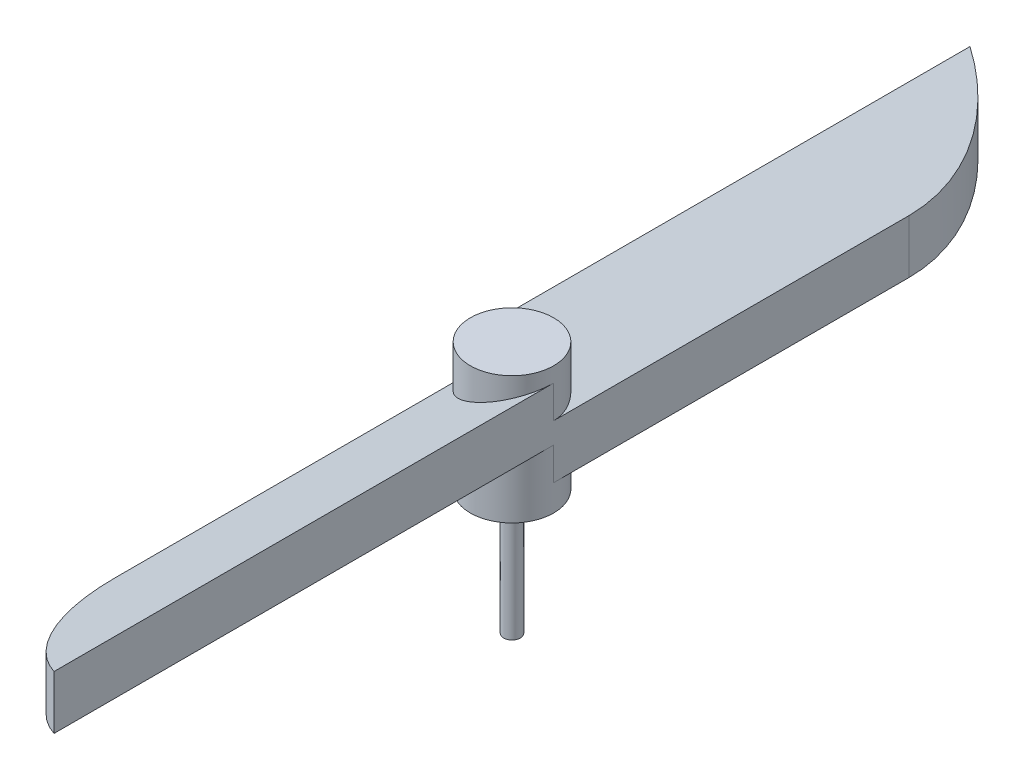
ISO-10303-21;
HEADER;
FILE_DESCRIPTION(('STEP AP214'),'2;1');
FILE_NAME('part.step','',(''),(''),'','','');
FILE_SCHEMA(('AUTOMOTIVE_DESIGN { 1 0 10303 214 1 1 1 1 }'));
ENDSEC;
DATA;
#1=APPLICATION_CONTEXT('core data for automotive mechanical design processes');
#2=APPLICATION_PROTOCOL_DEFINITION('international standard','automotive_design',2000,#1);
#3=PRODUCT_CONTEXT('',#1,'mechanical');
#4=PRODUCT('Part','Part','',(#3));
#5=PRODUCT_RELATED_PRODUCT_CATEGORY('part','',(#4));
#6=PRODUCT_DEFINITION_FORMATION('','',#4);
#7=PRODUCT_DEFINITION_CONTEXT('part definition',#1,'design');
#8=PRODUCT_DEFINITION('design','',#6,#7);
#9=PRODUCT_DEFINITION_SHAPE('','',#8);
#10=(LENGTH_UNIT() NAMED_UNIT(*) SI_UNIT(.MILLI.,.METRE.));
#11=(NAMED_UNIT(*) PLANE_ANGLE_UNIT() SI_UNIT($,.RADIAN.));
#12=(NAMED_UNIT(*) SI_UNIT($,.STERADIAN.) SOLID_ANGLE_UNIT());
#13=UNCERTAINTY_MEASURE_WITH_UNIT(LENGTH_MEASURE(1.E-05),#10,'distance_accuracy_value','');
#14=(GEOMETRIC_REPRESENTATION_CONTEXT(3) GLOBAL_UNCERTAINTY_ASSIGNED_CONTEXT((#13)) GLOBAL_UNIT_ASSIGNED_CONTEXT((#10,
#11,#12)) REPRESENTATION_CONTEXT('',''));
#15=CARTESIAN_POINT('',(0.,0.,0.));
#16=DIRECTION('',(0.,0.,1.));
#17=DIRECTION('',(1.,0.,0.));
#18=AXIS2_PLACEMENT_3D('',#15,#16,#17);
#19=CARTESIAN_POINT('',(-46.0014411221915,60.3501293978421,200.));
#20=DIRECTION('',(0.365067986182281,-0.930980862029298,0.));
#21=DIRECTION('',(0.9309808620293,0.36506798618228,0.));
#22=AXIS2_PLACEMENT_3D('',#19,#20,#21);
#23=PLANE('',#22);
#24=DIRECTION('',(0.,0.,1.));
#25=VECTOR('',#24,1.);
#26=CARTESIAN_POINT('',(2.50000000000003,79.3691277033729,200.000000000001));
#27=LINE('',#26,#25);
#28=CARTESIAN_POINT('',(2.5,79.3691277033728,0.));
#29=VERTEX_POINT('',#28);
#30=CARTESIAN_POINT('',(2.5,79.3691277033728,30.));
#31=VERTEX_POINT('',#30);
#32=EDGE_CURVE('E218',#29,#31,#27,.T.);
#33=ORIENTED_EDGE('',*,*,#32,.T.);
#34=CARTESIAN_POINT('',(7.50000000000001,81.3297909192984,21.3397459621556));
#35=DIRECTION('',(0.365067986182281,-0.930980862029298,0.));
#36=DIRECTION('',(0.9309808620293,0.36506798618228,0.));
#37=AXIS2_PLACEMENT_3D('',#34,#35,#36);
#38=ELLIPSE('',#37,10.7413593639321,10.);
#39=CARTESIAN_POINT('',(-2.5,77.4084644874475,21.3397459621557));
#40=VERTEX_POINT('',#39);
#41=EDGE_CURVE('E57',#31,#40,#38,.T.);
#42=ORIENTED_EDGE('',*,*,#41,.T.);
#43=DIRECTION('',(0.,0.,-1.));
#44=VECTOR('',#43,1.);
#45=CARTESIAN_POINT('',(-2.49999999999992,77.4084644874475,200.000000000001));
#46=LINE('',#45,#44);
#47=CARTESIAN_POINT('',(-2.5,77.4084644874474,0.));
#48=VERTEX_POINT('',#47);
#49=EDGE_CURVE('E112',#40,#48,#46,.T.);
#50=ORIENTED_EDGE('',*,*,#49,.T.);
#51=CARTESIAN_POINT('',(0.,78.3887960954102,0.));
#52=DIRECTION('',(0.365067986182281,-0.930980862029298,0.));
#53=DIRECTION('',(-0.9309808620293,-0.36506798618228,0.));
#54=AXIS2_PLACEMENT_3D('',#51,#52,#53);
#55=ELLIPSE('',#54,2.68533984098303,2.5);
#56=EDGE_CURVE('E141',#29,#48,#55,.T.);
#57=ORIENTED_EDGE('',*,*,#56,.F.);
#58=EDGE_LOOP('',(#33,#42,#50,#57));
#59=FACE_BOUND('',#58,.T.);
#60=ADVANCED_FACE('F33',(#59),#23,.T.);
#61=CARTESIAN_POINT('',(-47.0966450807384,63.14307198393,200.));
#62=DIRECTION('',(-0.365067986182281,0.930980862029298,0.));
#63=DIRECTION('',(-0.9309808620293,-0.36506798618228,0.));
#64=AXIS2_PLACEMENT_3D('',#61,#62,#63);
#65=PLANE('',#64);
#66=DIRECTION('',(0.,0.,1.));
#67=VECTOR('',#66,1.);
#68=CARTESIAN_POINT('',(-2.49999999999997,80.6308722966271,200.000000000001));
#69=LINE('',#68,#67);
#70=CARTESIAN_POINT('',(-2.5,80.6308722966271,0.));
#71=VERTEX_POINT('',#70);
#72=CARTESIAN_POINT('',(-2.49999999999997,80.630872296627,21.3397459621557));
#73=VERTEX_POINT('',#72);
#74=EDGE_CURVE('E146',#71,#73,#69,.T.);
#75=ORIENTED_EDGE('',*,*,#74,.T.);
#76=CARTESIAN_POINT('',(7.50000000000001,84.552198728478,21.3397459621556));
#77=DIRECTION('',(-0.365067986182281,0.930980862029298,0.));
#78=DIRECTION('',(0.9309808620293,0.36506798618228,0.));
#79=AXIS2_PLACEMENT_3D('',#76,#77,#78);
#80=ELLIPSE('',#79,10.7413593639321,10.);
#81=CARTESIAN_POINT('',(2.5,82.5915355125524,30.));
#82=VERTEX_POINT('',#81);
#83=EDGE_CURVE('E155',#73,#82,#80,.T.);
#84=ORIENTED_EDGE('',*,*,#83,.T.);
#85=DIRECTION('',(0.,0.,-1.));
#86=VECTOR('',#85,1.);
#87=CARTESIAN_POINT('',(2.50000000000003,82.5915355125525,200.000000000001));
#88=LINE('',#87,#86);
#89=CARTESIAN_POINT('',(2.5,82.5915355125525,0.));
#90=VERTEX_POINT('',#89);
#91=EDGE_CURVE('E144',#82,#90,#88,.T.);
#92=ORIENTED_EDGE('',*,*,#91,.T.);
#93=CARTESIAN_POINT('',(0.,81.6112039045898,0.));
#94=DIRECTION('',(-0.365067986182281,0.930980862029298,0.));
#95=DIRECTION('',(-0.9309808620293,-0.36506798618228,0.));
#96=AXIS2_PLACEMENT_3D('',#93,#94,#95);
#97=ELLIPSE('',#96,2.68533984098303,2.5);
#98=EDGE_CURVE('E107',#71,#90,#97,.T.);
#99=ORIENTED_EDGE('',*,*,#98,.F.);
#100=EDGE_LOOP('',(#75,#84,#92,#99));
#101=FACE_BOUND('',#100,.T.);
#102=ADVANCED_FACE('F182',(#101),#65,.T.);
#103=CARTESIAN_POINT('',(-1.11022302462516E-13,100.,0.));
#104=DIRECTION('',(0.,-1.,0.));
#105=DIRECTION('',(0.,0.,-1.));
#106=AXIS2_PLACEMENT_3D('',#103,#104,#105);
#107=CYLINDRICAL_SURFACE('',#106,2.5);
#108=CARTESIAN_POINT('',(0.,75.8299404564052,0.));
#109=DIRECTION('',(0.,1.,0.));
#110=DIRECTION('',(0.,0.,1.));
#111=AXIS2_PLACEMENT_3D('',#108,#109,#110);
#112=CIRCLE('',#111,2.5);
#113=CARTESIAN_POINT('',(0.,75.8299404564052,2.49999999999995));
#114=VERTEX_POINT('',#113);
#115=EDGE_CURVE('E37',#114,#114,#112,.T.);
#116=ORIENTED_EDGE('',*,*,#115,.T.);
#117=EDGE_LOOP('',(#116));
#118=FACE_BOUND('',#117,.T.);
#119=ORIENTED_EDGE('',*,*,#56,.T.);
#120=DIRECTION('',(0.,-1.,0.));
#121=VECTOR('',#120,1.);
#122=CARTESIAN_POINT('',(-2.50000000000006,100.,0.));
#123=LINE('',#122,#121);
#124=CARTESIAN_POINT('',(-2.5,79.3691277033728,0.));
#125=VERTEX_POINT('',#124);
#126=EDGE_CURVE('E111',#125,#48,#123,.T.);
#127=ORIENTED_EDGE('',*,*,#126,.F.);
#128=CARTESIAN_POINT('',(0.,78.3887960954102,0.));
#129=DIRECTION('',(-0.365067986182281,-0.930980862029298,0.));
#130=DIRECTION('',(0.9309808620293,-0.36506798618228,0.));
#131=AXIS2_PLACEMENT_3D('',#128,#129,#130);
#132=ELLIPSE('',#131,2.68533984098303,2.5);
#133=CARTESIAN_POINT('',(2.5,77.4084644874474,0.));
#134=VERTEX_POINT('',#133);
#135=EDGE_CURVE('E128',#125,#134,#132,.T.);
#136=ORIENTED_EDGE('',*,*,#135,.T.);
#137=DIRECTION('',(0.,-1.,0.));
#138=VECTOR('',#137,1.);
#139=CARTESIAN_POINT('',(2.49999999999986,100.,0.));
#140=LINE('',#139,#138);
#141=EDGE_CURVE('E123',#29,#134,#140,.T.);
#142=ORIENTED_EDGE('',*,*,#141,.F.);
#143=EDGE_LOOP('',(#119,#127,#136,#142));
#144=FACE_BOUND('',#143,.T.);
#145=ADVANCED_FACE('F162',(#118,#144),#107,.T.);
#146=CARTESIAN_POINT('',(46.0014411221915,60.3501293978421,-200.000000000001));
#147=DIRECTION('',(-0.365067986182281,-0.930980862029298,0.));
#148=DIRECTION('',(0.9309808620293,-0.36506798618228,0.));
#149=AXIS2_PLACEMENT_3D('',#146,#147,#148);
#150=PLANE('',#149);
#151=DIRECTION('',(0.,0.,-1.));
#152=VECTOR('',#151,1.);
#153=CARTESIAN_POINT('',(-2.49999999999997,79.3691277033729,-200.000000000001));
#154=LINE('',#153,#152);
#155=CARTESIAN_POINT('',(-2.49999999999997,79.369127703373,-30.0000000000001));
#156=VERTEX_POINT('',#155);
#157=EDGE_CURVE('E133',#125,#156,#154,.T.);
#158=ORIENTED_EDGE('',*,*,#157,.T.);
#159=CARTESIAN_POINT('',(-7.50000000000001,81.3297909192983,-21.3397459621557));
#160=DIRECTION('',(-0.365067986182281,-0.930980862029298,0.));
#161=DIRECTION('',(-0.9309808620293,0.36506798618228,0.));
#162=AXIS2_PLACEMENT_3D('',#159,#160,#161);
#163=ELLIPSE('',#162,10.7413593639321,10.);
#164=CARTESIAN_POINT('',(2.50000000000003,77.4084644874475,-21.3397459621557));
#165=VERTEX_POINT('',#164);
#166=EDGE_CURVE('E148',#156,#165,#163,.T.);
#167=ORIENTED_EDGE('',*,*,#166,.T.);
#168=DIRECTION('',(0.,0.,1.));
#169=VECTOR('',#168,1.);
#170=CARTESIAN_POINT('',(2.50000000000003,77.4084644874475,-200.000000000001));
#171=LINE('',#170,#169);
#172=EDGE_CURVE('E229',#165,#134,#171,.T.);
#173=ORIENTED_EDGE('',*,*,#172,.T.);
#174=ORIENTED_EDGE('',*,*,#135,.F.);
#175=EDGE_LOOP('',(#158,#167,#173,#174));
#176=FACE_BOUND('',#175,.T.);
#177=ADVANCED_FACE('F196',(#176),#150,.T.);
#178=CARTESIAN_POINT('',(47.0966450807384,63.1430719839299,-200.000000000001));
#179=DIRECTION('',(0.365067986182281,0.930980862029298,0.));
#180=DIRECTION('',(-0.9309808620293,0.36506798618228,0.));
#181=AXIS2_PLACEMENT_3D('',#178,#179,#180);
#182=PLANE('',#181);
#183=DIRECTION('',(0.,0.,-1.));
#184=VECTOR('',#183,1.);
#185=CARTESIAN_POINT('',(2.50000000000003,80.6308722966271,-200.000000000001));
#186=LINE('',#185,#184);
#187=CARTESIAN_POINT('',(2.5,80.6308722966271,0.));
#188=VERTEX_POINT('',#187);
#189=CARTESIAN_POINT('',(2.5,80.630872296627,-21.3397459621557));
#190=VERTEX_POINT('',#189);
#191=EDGE_CURVE('E115',#188,#190,#186,.T.);
#192=ORIENTED_EDGE('',*,*,#191,.T.);
#193=CARTESIAN_POINT('',(-7.50000000000001,84.5521987284779,-21.3397459621557));
#194=DIRECTION('',(0.365067986182281,0.930980862029298,0.));
#195=DIRECTION('',(-0.9309808620293,0.36506798618228,0.));
#196=AXIS2_PLACEMENT_3D('',#193,#194,#195);
#197=ELLIPSE('',#196,10.7413593639321,10.);
#198=CARTESIAN_POINT('',(-2.5,82.5915355125526,-30.0000000000001));
#199=VERTEX_POINT('',#198);
#200=EDGE_CURVE('E151',#190,#199,#197,.T.);
#201=ORIENTED_EDGE('',*,*,#200,.T.);
#202=DIRECTION('',(0.,0.,1.));
#203=VECTOR('',#202,1.);
#204=CARTESIAN_POINT('',(-2.5,82.5915355125525,-200.000000000001));
#205=LINE('',#204,#203);
#206=CARTESIAN_POINT('',(-2.5,82.5915355125525,0.));
#207=VERTEX_POINT('',#206);
#208=EDGE_CURVE('E122',#199,#207,#205,.T.);
#209=ORIENTED_EDGE('',*,*,#208,.T.);
#210=CARTESIAN_POINT('',(0.,81.6112039045898,0.));
#211=DIRECTION('',(0.365067986182281,0.930980862029298,0.));
#212=DIRECTION('',(0.9309808620293,-0.36506798618228,0.));
#213=AXIS2_PLACEMENT_3D('',#210,#211,#212);
#214=ELLIPSE('',#213,2.68533984098303,2.5);
#215=EDGE_CURVE('E105',#188,#207,#214,.T.);
#216=ORIENTED_EDGE('',*,*,#215,.F.);
#217=EDGE_LOOP('',(#192,#201,#209,#216));
#218=FACE_BOUND('',#217,.T.);
#219=ADVANCED_FACE('F126',(#218),#182,.T.);
#220=ORIENTED_EDGE('',*,*,#215,.T.);
#221=DIRECTION('',(0.,-1.,0.));
#222=VECTOR('',#221,1.);
#223=CARTESIAN_POINT('',(-2.50000000000006,100.,0.));
#224=LINE('',#223,#222);
#225=EDGE_CURVE('E129',#71,#207,#224,.F.);
#226=ORIENTED_EDGE('',*,*,#225,.F.);
#227=ORIENTED_EDGE('',*,*,#98,.T.);
#228=DIRECTION('',(0.,-1.,0.));
#229=VECTOR('',#228,1.);
#230=CARTESIAN_POINT('',(2.49999999999986,100.,0.));
#231=LINE('',#230,#229);
#232=EDGE_CURVE('E99',#188,#90,#231,.F.);
#233=ORIENTED_EDGE('',*,*,#232,.F.);
#234=EDGE_LOOP('',(#220,#226,#227,#233));
#235=FACE_BOUND('',#234,.T.);
#236=CARTESIAN_POINT('',(0.,83.4888782326502,0.));
#237=DIRECTION('',(0.,-1.,0.));
#238=DIRECTION('',(0.,0.,-1.));
#239=AXIS2_PLACEMENT_3D('',#236,#237,#238);
#240=CIRCLE('',#239,2.5);
#241=CARTESIAN_POINT('',(0.,83.4888782326502,-2.50000000000003));
#242=VERTEX_POINT('',#241);
#243=EDGE_CURVE('E156',#242,#242,#240,.T.);
#244=ORIENTED_EDGE('',*,*,#243,.T.);
#245=EDGE_LOOP('',(#244));
#246=FACE_BOUND('',#245,.T.);
#247=ADVANCED_FACE('F101',(#235,#246),#107,.T.);
#248=CARTESIAN_POINT('',(-2.5,305.876368794046,0.));
#249=DIRECTION('',(-1.,0.,0.));
#250=DIRECTION('',(0.,0.,1.));
#251=AXIS2_PLACEMENT_3D('',#248,#249,#250);
#252=PLANE('',#251);
#253=ORIENTED_EDGE('',*,*,#49,.F.);
#254=DIRECTION('',(0.,-1.,0.));
#255=VECTOR('',#254,1.);
#256=CARTESIAN_POINT('',(-2.49999999999997,80.6308722966271,21.3397459621557));
#257=LINE('',#256,#255);
#258=EDGE_CURVE('E49',#40,#73,#257,.F.);
#259=ORIENTED_EDGE('',*,*,#258,.T.);
#260=ORIENTED_EDGE('',*,*,#74,.F.);
#261=ORIENTED_EDGE('',*,*,#225,.T.);
#262=ORIENTED_EDGE('',*,*,#208,.F.);
#263=DIRECTION('',(0.,-1.,0.));
#264=VECTOR('',#263,1.);
#265=CARTESIAN_POINT('',(-2.5,305.876368794046,-30.0000000000001));
#266=LINE('',#265,#264);
#267=EDGE_CURVE('E211',#199,#156,#266,.T.);
#268=ORIENTED_EDGE('',*,*,#267,.T.);
#269=ORIENTED_EDGE('',*,*,#157,.F.);
#270=ORIENTED_EDGE('',*,*,#126,.T.);
#271=EDGE_LOOP('',(#253,#259,#260,#261,#262,#268,#269,#270));
#272=FACE_BOUND('',#271,.T.);
#273=ADVANCED_FACE('F193',(#272),#252,.T.);
#274=CARTESIAN_POINT('',(2.5,305.876368794046,0.));
#275=DIRECTION('',(1.,0.,0.));
#276=DIRECTION('',(0.,0.,-1.));
#277=AXIS2_PLACEMENT_3D('',#274,#275,#276);
#278=PLANE('',#277);
#279=ORIENTED_EDGE('',*,*,#172,.F.);
#280=DIRECTION('',(0.,-1.,0.));
#281=VECTOR('',#280,1.);
#282=CARTESIAN_POINT('',(2.5,80.6308722966271,-21.3397459621557));
#283=LINE('',#282,#281);
#284=EDGE_CURVE('E119',#165,#190,#283,.F.);
#285=ORIENTED_EDGE('',*,*,#284,.T.);
#286=ORIENTED_EDGE('',*,*,#191,.F.);
#287=ORIENTED_EDGE('',*,*,#232,.T.);
#288=ORIENTED_EDGE('',*,*,#91,.F.);
#289=DIRECTION('',(0.,-1.,0.));
#290=VECTOR('',#289,1.);
#291=CARTESIAN_POINT('',(2.5,334.879586361473,30.));
#292=LINE('',#291,#290);
#293=EDGE_CURVE('E217',#82,#31,#292,.T.);
#294=ORIENTED_EDGE('',*,*,#293,.T.);
#295=ORIENTED_EDGE('',*,*,#32,.F.);
#296=ORIENTED_EDGE('',*,*,#141,.T.);
#297=EDGE_LOOP('',(#279,#285,#286,#287,#288,#294,#295,#296));
#298=FACE_BOUND('',#297,.T.);
#299=ADVANCED_FACE('F117',(#298),#278,.T.);
#300=CARTESIAN_POINT('',(-7.50000000000006,305.876368794046,-21.3397459621557));
#301=DIRECTION('',(0.,1.,0.));
#302=DIRECTION('',(0.,0.,1.));
#303=AXIS2_PLACEMENT_3D('',#300,#301,#302);
#304=CYLINDRICAL_SURFACE('',#303,10.);
#305=ORIENTED_EDGE('',*,*,#200,.F.);
#306=ORIENTED_EDGE('',*,*,#284,.F.);
#307=ORIENTED_EDGE('',*,*,#166,.F.);
#308=ORIENTED_EDGE('',*,*,#267,.F.);
#309=EDGE_LOOP('',(#305,#306,#307,#308));
#310=FACE_BOUND('',#309,.T.);
#311=ADVANCED_FACE('F192',(#310),#304,.T.);
#312=CARTESIAN_POINT('',(7.49999999999998,334.879586361473,21.3397459621556));
#313=DIRECTION('',(0.,1.,0.));
#314=DIRECTION('',(0.,0.,1.));
#315=AXIS2_PLACEMENT_3D('',#312,#313,#314);
#316=CYLINDRICAL_SURFACE('',#315,10.);
#317=ORIENTED_EDGE('',*,*,#83,.F.);
#318=ORIENTED_EDGE('',*,*,#258,.F.);
#319=ORIENTED_EDGE('',*,*,#41,.F.);
#320=ORIENTED_EDGE('',*,*,#293,.F.);
#321=EDGE_LOOP('',(#317,#318,#319,#320));
#322=FACE_BOUND('',#321,.T.);
#323=ADVANCED_FACE('F35',(#322),#316,.T.);
#324=CARTESIAN_POINT('',(-2.5,83.4888782326502,16.2266058509353));
#325=DIRECTION('',(0.,-1.,0.));
#326=DIRECTION('',(0.,0.,-1.));
#327=AXIS2_PLACEMENT_3D('',#324,#325,#326);
#328=PLANE('',#327);
#329=ORIENTED_EDGE('',*,*,#243,.F.);
#330=EDGE_LOOP('',(#329));
#331=FACE_BOUND('',#330,.T.);
#332=ADVANCED_FACE('F168',(#331),#328,.F.);
#333=CARTESIAN_POINT('',(-2.49999999999995,75.8299404564052,5.04326478655533));
#334=DIRECTION('',(0.,1.,0.));
#335=DIRECTION('',(0.,0.,1.));
#336=AXIS2_PLACEMENT_3D('',#333,#334,#335);
#337=PLANE('',#336);
#338=CARTESIAN_POINT('',(0.,75.8299404564052,0.));
#339=DIRECTION('',(0.,-1.,0.));
#340=DIRECTION('',(0.,0.,-1.));
#341=AXIS2_PLACEMENT_3D('',#338,#339,#340);
#342=CIRCLE('',#341,0.5);
#343=CARTESIAN_POINT('',(0.,75.8299404564052,-0.500000000000057));
#344=VERTEX_POINT('',#343);
#345=EDGE_CURVE('E11',#344,#344,#342,.T.);
#346=ORIENTED_EDGE('',*,*,#345,.F.);
#347=EDGE_LOOP('',(#346));
#348=FACE_BOUND('',#347,.T.);
#349=ORIENTED_EDGE('',*,*,#115,.F.);
#350=EDGE_LOOP('',(#349));
#351=FACE_BOUND('',#350,.T.);
#352=ADVANCED_FACE('F165',(#348,#351),#337,.F.);
#353=CARTESIAN_POINT('',(0.,68.3299404564051,0.));
#354=DIRECTION('',(0.,1.,0.));
#355=DIRECTION('',(0.,0.,1.));
#356=AXIS2_PLACEMENT_3D('',#353,#354,#355);
#357=CYLINDRICAL_SURFACE('',#356,0.5);
#358=CARTESIAN_POINT('',(0.,68.3299404564051,0.));
#359=DIRECTION('',(0.,-1.,0.));
#360=DIRECTION('',(0.,0.,-1.));
#361=AXIS2_PLACEMENT_3D('',#358,#359,#360);
#362=CIRCLE('',#361,0.5);
#363=CARTESIAN_POINT('',(0.,68.3299404564051,-0.500000000000029));
#364=VERTEX_POINT('',#363);
#365=EDGE_CURVE('E219',#364,#364,#362,.T.);
#366=ORIENTED_EDGE('',*,*,#365,.F.);
#367=EDGE_LOOP('',(#366));
#368=FACE_BOUND('',#367,.T.);
#369=ORIENTED_EDGE('',*,*,#345,.T.);
#370=EDGE_LOOP('',(#369));
#371=FACE_BOUND('',#370,.T.);
#372=ADVANCED_FACE('F167',(#368,#371),#357,.T.);
#373=CARTESIAN_POINT('',(0.,68.3299404564051,0.));
#374=DIRECTION('',(0.,-1.,0.));
#375=DIRECTION('',(0.,0.,-1.));
#376=AXIS2_PLACEMENT_3D('',#373,#374,#375);
#377=PLANE('',#376);
#378=ORIENTED_EDGE('',*,*,#365,.T.);
#379=EDGE_LOOP('',(#378));
#380=FACE_BOUND('',#379,.T.);
#381=ADVANCED_FACE('F175',(#380),#377,.T.);
#382=CLOSED_SHELL('',(#60,#102,#145,#177,#219,#247,#273,#299,#311,#323,#332,#352,#372,#381));
#383=MANIFOLD_SOLID_BREP('B2',#382);
#384=ADVANCED_BREP_SHAPE_REPRESENTATION('',(#18,#383),#14);
#385=SHAPE_DEFINITION_REPRESENTATION(#9,#384);
ENDSEC;
END-ISO-10303-21;
